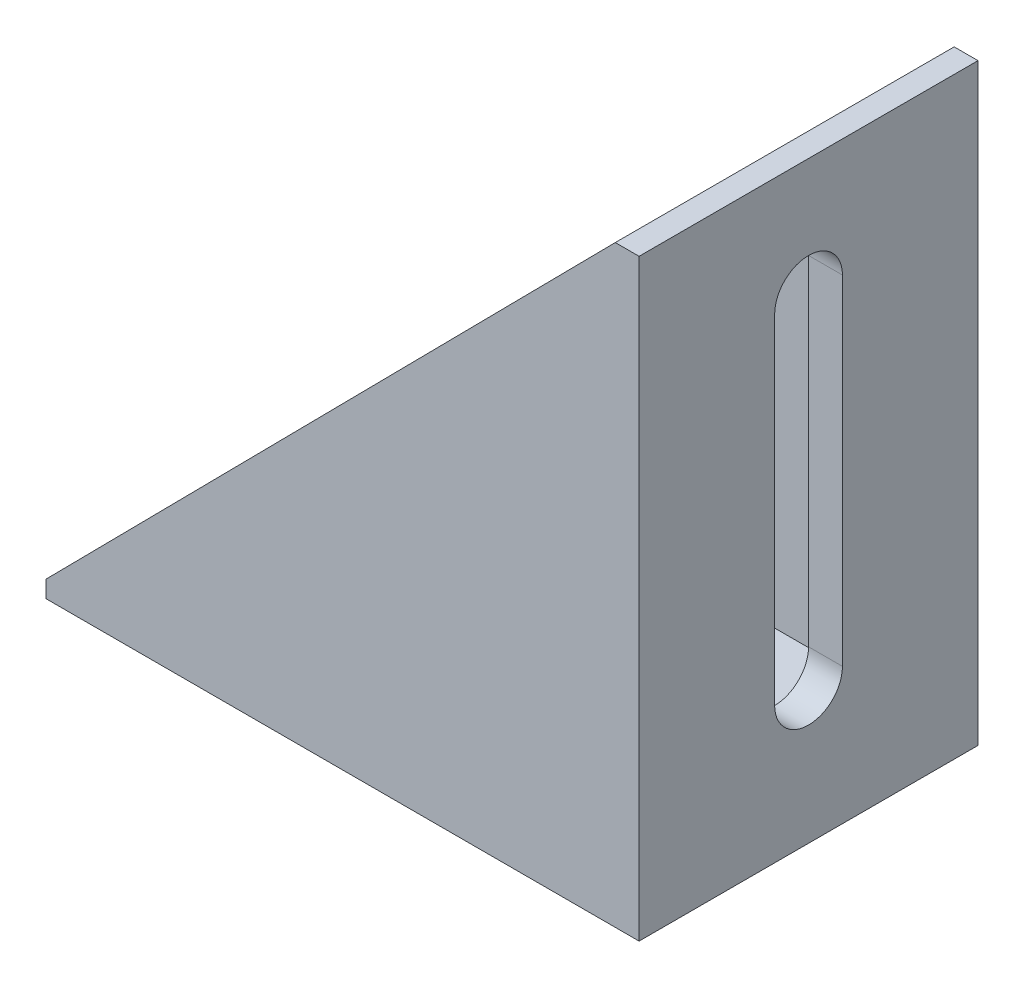
ISO-10303-21;
HEADER;
FILE_DESCRIPTION(('STEP AP214'),'2;1');
FILE_NAME('part.step','',(''),(''),'','','');
FILE_SCHEMA(('AUTOMOTIVE_DESIGN { 1 0 10303 214 1 1 1 1 }'));
ENDSEC;
DATA;
#1=APPLICATION_CONTEXT('core data for automotive mechanical design processes');
#2=APPLICATION_PROTOCOL_DEFINITION('international standard','automotive_design',2000,#1);
#3=PRODUCT_CONTEXT('',#1,'mechanical');
#4=PRODUCT('Part','Part','',(#3));
#5=PRODUCT_RELATED_PRODUCT_CATEGORY('part','',(#4));
#6=PRODUCT_DEFINITION_FORMATION('','',#4);
#7=PRODUCT_DEFINITION_CONTEXT('part definition',#1,'design');
#8=PRODUCT_DEFINITION('design','',#6,#7);
#9=PRODUCT_DEFINITION_SHAPE('','',#8);
#10=(LENGTH_UNIT() NAMED_UNIT(*) SI_UNIT(.MILLI.,.METRE.));
#11=(NAMED_UNIT(*) PLANE_ANGLE_UNIT() SI_UNIT($,.RADIAN.));
#12=(NAMED_UNIT(*) SI_UNIT($,.STERADIAN.) SOLID_ANGLE_UNIT());
#13=UNCERTAINTY_MEASURE_WITH_UNIT(LENGTH_MEASURE(1.E-05),#10,'distance_accuracy_value','');
#14=(GEOMETRIC_REPRESENTATION_CONTEXT(3) GLOBAL_UNCERTAINTY_ASSIGNED_CONTEXT((#13)) GLOBAL_UNIT_ASSIGNED_CONTEXT((#10,
#11,#12)) REPRESENTATION_CONTEXT('',''));
#15=CARTESIAN_POINT('',(0.,0.,0.));
#16=DIRECTION('',(0.,0.,1.));
#17=DIRECTION('',(1.,0.,0.));
#18=AXIS2_PLACEMENT_3D('',#15,#16,#17);
#19=CARTESIAN_POINT('',(0.,0.,10.));
#20=DIRECTION('',(1.,0.,0.));
#21=DIRECTION('',(0.,0.,-1.));
#22=AXIS2_PLACEMENT_3D('',#19,#20,#21);
#23=PLANE('',#22);
#24=DIRECTION('',(0.,-1.,0.));
#25=VECTOR('',#24,1.);
#26=CARTESIAN_POINT('',(0.,0.,0.));
#27=LINE('',#26,#25);
#28=CARTESIAN_POINT('',(0.,1.,0.));
#29=VERTEX_POINT('',#28);
#30=CARTESIAN_POINT('',(0.,0.,0.));
#31=VERTEX_POINT('',#30);
#32=EDGE_CURVE('E248',#29,#31,#27,.T.);
#33=ORIENTED_EDGE('',*,*,#32,.T.);
#34=DIRECTION('',(0.,0.,-1.));
#35=VECTOR('',#34,1.);
#36=CARTESIAN_POINT('',(0.,0.,10.));
#37=LINE('',#36,#35);
#38=CARTESIAN_POINT('',(0.,0.,20.));
#39=VERTEX_POINT('',#38);
#40=EDGE_CURVE('E268',#39,#31,#37,.T.);
#41=ORIENTED_EDGE('',*,*,#40,.F.);
#42=DIRECTION('',(0.,-1.,0.));
#43=VECTOR('',#42,1.);
#44=CARTESIAN_POINT('',(0.,0.,20.));
#45=LINE('',#44,#43);
#46=CARTESIAN_POINT('',(0.,1.,20.));
#47=VERTEX_POINT('',#46);
#48=EDGE_CURVE('E190',#47,#39,#45,.T.);
#49=ORIENTED_EDGE('',*,*,#48,.F.);
#50=DIRECTION('',(0.,0.,-1.));
#51=VECTOR('',#50,1.);
#52=CARTESIAN_POINT('',(0.,1.,10.));
#53=LINE('',#52,#51);
#54=EDGE_CURVE('E258',#47,#29,#53,.T.);
#55=ORIENTED_EDGE('',*,*,#54,.T.);
#56=EDGE_LOOP('',(#33,#41,#49,#55));
#57=FACE_BOUND('',#56,.T.);
#58=ADVANCED_FACE('F32',(#57),#23,.F.);
#59=CARTESIAN_POINT('',(0.,0.,10.));
#60=DIRECTION('',(0.,1.,0.));
#61=DIRECTION('',(0.,0.,1.));
#62=AXIS2_PLACEMENT_3D('',#59,#60,#61);
#63=PLANE('',#62);
#64=CARTESIAN_POINT('',(7.66929229058759,0.,10.));
#65=DIRECTION('',(0.,1.,0.));
#66=DIRECTION('',(0.,0.,1.));
#67=AXIS2_PLACEMENT_3D('',#64,#65,#66);
#68=CIRCLE('',#67,2.);
#69=CARTESIAN_POINT('',(7.66929229058759,0.,8.));
#70=VERTEX_POINT('',#69);
#71=CARTESIAN_POINT('',(7.66929229058759,0.,12.));
#72=VERTEX_POINT('',#71);
#73=EDGE_CURVE('E234',#70,#72,#68,.T.);
#74=ORIENTED_EDGE('',*,*,#73,.T.);
#75=DIRECTION('',(-1.,0.,0.));
#76=VECTOR('',#75,1.);
#77=CARTESIAN_POINT('',(0.,0.,12.));
#78=LINE('',#77,#76);
#79=CARTESIAN_POINT('',(27.6692922905876,0.,12.));
#80=VERTEX_POINT('',#79);
#81=EDGE_CURVE('E179',#80,#72,#78,.T.);
#82=ORIENTED_EDGE('',*,*,#81,.F.);
#83=CARTESIAN_POINT('',(27.6692922905876,0.,10.));
#84=DIRECTION('',(0.,1.,0.));
#85=DIRECTION('',(0.,0.,1.));
#86=AXIS2_PLACEMENT_3D('',#83,#84,#85);
#87=CIRCLE('',#86,2.);
#88=CARTESIAN_POINT('',(27.6692922905876,0.,8.));
#89=VERTEX_POINT('',#88);
#90=EDGE_CURVE('E227',#80,#89,#87,.T.);
#91=ORIENTED_EDGE('',*,*,#90,.T.);
#92=DIRECTION('',(-1.,0.,0.));
#93=VECTOR('',#92,1.);
#94=CARTESIAN_POINT('',(0.,0.,8.));
#95=LINE('',#94,#93);
#96=EDGE_CURVE('E231',#89,#70,#95,.T.);
#97=ORIENTED_EDGE('',*,*,#96,.T.);
#98=EDGE_LOOP('',(#74,#82,#91,#97));
#99=FACE_BOUND('',#98,.T.);
#100=DIRECTION('',(1.,0.,0.));
#101=VECTOR('',#100,1.);
#102=CARTESIAN_POINT('',(0.,0.,20.));
#103=LINE('',#102,#101);
#104=CARTESIAN_POINT('',(35.,0.,20.));
#105=VERTEX_POINT('',#104);
#106=EDGE_CURVE('E193',#39,#105,#103,.T.);
#107=ORIENTED_EDGE('',*,*,#106,.F.);
#108=ORIENTED_EDGE('',*,*,#40,.T.);
#109=DIRECTION('',(1.,0.,0.));
#110=VECTOR('',#109,1.);
#111=CARTESIAN_POINT('',(0.,0.,0.));
#112=LINE('',#111,#110);
#113=CARTESIAN_POINT('',(35.,0.,0.));
#114=VERTEX_POINT('',#113);
#115=EDGE_CURVE('E251',#31,#114,#112,.T.);
#116=ORIENTED_EDGE('',*,*,#115,.T.);
#117=DIRECTION('',(0.,0.,-1.));
#118=VECTOR('',#117,1.);
#119=CARTESIAN_POINT('',(35.,0.,10.));
#120=LINE('',#119,#118);
#121=EDGE_CURVE('E265',#105,#114,#120,.T.);
#122=ORIENTED_EDGE('',*,*,#121,.F.);
#123=EDGE_LOOP('',(#107,#108,#116,#122));
#124=FACE_BOUND('',#123,.T.);
#125=ADVANCED_FACE('F294',(#99,#124),#63,.F.);
#126=CARTESIAN_POINT('',(35.,0.,10.));
#127=DIRECTION('',(-1.,0.,0.));
#128=DIRECTION('',(0.,0.,1.));
#129=AXIS2_PLACEMENT_3D('',#126,#127,#128);
#130=PLANE('',#129);
#131=DIRECTION('',(0.,0.,-1.));
#132=VECTOR('',#131,1.);
#133=CARTESIAN_POINT('',(35.,35.,10.));
#134=LINE('',#133,#132);
#135=CARTESIAN_POINT('',(35.,35.,20.));
#136=VERTEX_POINT('',#135);
#137=CARTESIAN_POINT('',(35.,35.,0.));
#138=VERTEX_POINT('',#137);
#139=EDGE_CURVE('E262',#136,#138,#134,.T.);
#140=ORIENTED_EDGE('',*,*,#139,.F.);
#141=DIRECTION('',(0.,1.,0.));
#142=VECTOR('',#141,1.);
#143=CARTESIAN_POINT('',(35.,0.,20.));
#144=LINE('',#143,#142);
#145=EDGE_CURVE('E196',#105,#136,#144,.T.);
#146=ORIENTED_EDGE('',*,*,#145,.F.);
#147=ORIENTED_EDGE('',*,*,#121,.T.);
#148=DIRECTION('',(0.,1.,0.));
#149=VECTOR('',#148,1.);
#150=CARTESIAN_POINT('',(35.,0.,0.));
#151=LINE('',#150,#149);
#152=EDGE_CURVE('E253',#114,#138,#151,.T.);
#153=ORIENTED_EDGE('',*,*,#152,.T.);
#154=EDGE_LOOP('',(#140,#146,#147,#153));
#155=FACE_BOUND('',#154,.T.);
#156=DIRECTION('',(0.,-1.,0.));
#157=VECTOR('',#156,1.);
#158=CARTESIAN_POINT('',(35.,0.,12.));
#159=LINE('',#158,#157);
#160=CARTESIAN_POINT('',(35.,28.0425715749163,12.));
#161=VERTEX_POINT('',#160);
#162=CARTESIAN_POINT('',(35.,8.04257157491626,12.));
#163=VERTEX_POINT('',#162);
#164=EDGE_CURVE('E163',#161,#163,#159,.T.);
#165=ORIENTED_EDGE('',*,*,#164,.F.);
#166=CARTESIAN_POINT('',(35.,28.0425715749163,10.));
#167=DIRECTION('',(-1.,0.,0.));
#168=DIRECTION('',(0.,0.,1.));
#169=AXIS2_PLACEMENT_3D('',#166,#167,#168);
#170=CIRCLE('',#169,2.);
#171=CARTESIAN_POINT('',(35.,28.0425715749163,8.));
#172=VERTEX_POINT('',#171);
#173=EDGE_CURVE('E216',#161,#172,#170,.T.);
#174=ORIENTED_EDGE('',*,*,#173,.T.);
#175=DIRECTION('',(0.,-1.,0.));
#176=VECTOR('',#175,1.);
#177=CARTESIAN_POINT('',(35.,0.,8.));
#178=LINE('',#177,#176);
#179=CARTESIAN_POINT('',(35.,8.04257157491626,8.));
#180=VERTEX_POINT('',#179);
#181=EDGE_CURVE('E210',#172,#180,#178,.T.);
#182=ORIENTED_EDGE('',*,*,#181,.T.);
#183=CARTESIAN_POINT('',(35.,8.04257157491626,10.));
#184=DIRECTION('',(-1.,0.,0.));
#185=DIRECTION('',(0.,0.,1.));
#186=AXIS2_PLACEMENT_3D('',#183,#184,#185);
#187=CIRCLE('',#186,2.);
#188=EDGE_CURVE('E214',#180,#163,#187,.T.);
#189=ORIENTED_EDGE('',*,*,#188,.T.);
#190=EDGE_LOOP('',(#165,#174,#182,#189));
#191=FACE_BOUND('',#190,.T.);
#192=ADVANCED_FACE('F297',(#155,#191),#130,.F.);
#193=CARTESIAN_POINT('',(35.,35.,10.));
#194=DIRECTION('',(0.,-1.,0.));
#195=DIRECTION('',(0.,0.,-1.));
#196=AXIS2_PLACEMENT_3D('',#193,#194,#195);
#197=PLANE('',#196);
#198=DIRECTION('',(-1.,0.,0.));
#199=VECTOR('',#198,1.);
#200=CARTESIAN_POINT('',(35.,35.,0.));
#201=LINE('',#200,#199);
#202=CARTESIAN_POINT('',(33.5942254360332,35.,0.));
#203=VERTEX_POINT('',#202);
#204=EDGE_CURVE('E255',#138,#203,#201,.T.);
#205=ORIENTED_EDGE('',*,*,#204,.T.);
#206=DIRECTION('',(0.,0.,-1.));
#207=VECTOR('',#206,1.);
#208=CARTESIAN_POINT('',(33.5942254360332,35.,10.));
#209=LINE('',#208,#207);
#210=CARTESIAN_POINT('',(33.5942254360332,35.,20.));
#211=VERTEX_POINT('',#210);
#212=EDGE_CURVE('E260',#211,#203,#209,.T.);
#213=ORIENTED_EDGE('',*,*,#212,.F.);
#214=DIRECTION('',(-1.,0.,0.));
#215=VECTOR('',#214,1.);
#216=CARTESIAN_POINT('',(35.,35.,20.));
#217=LINE('',#216,#215);
#218=EDGE_CURVE('E199',#136,#211,#217,.T.);
#219=ORIENTED_EDGE('',*,*,#218,.F.);
#220=ORIENTED_EDGE('',*,*,#139,.T.);
#221=EDGE_LOOP('',(#205,#213,#219,#220));
#222=FACE_BOUND('',#221,.T.);
#223=ADVANCED_FACE('F314',(#222),#197,.F.);
#224=CARTESIAN_POINT('',(33.5942254360332,35.,10.));
#225=DIRECTION('',(0.711338793248483,-0.702849287699569,0.));
#226=DIRECTION('',(0.702849287699569,0.711338793248483,0.));
#227=AXIS2_PLACEMENT_3D('',#224,#225,#226);
#228=PLANE('',#227);
#229=DIRECTION('',(0.,0.,1.));
#230=VECTOR('',#229,1.);
#231=CARTESIAN_POINT('',(33.,34.398597093313,10.));
#232=LINE('',#231,#230);
#233=CARTESIAN_POINT('',(33.,34.398597093313,2.));
#234=VERTEX_POINT('',#233);
#235=CARTESIAN_POINT('',(33.,34.398597093313,18.));
#236=VERTEX_POINT('',#235);
#237=EDGE_CURVE('E246',#234,#236,#232,.T.);
#238=ORIENTED_EDGE('',*,*,#237,.T.);
#239=DIRECTION('',(0.702849287699569,0.711338793248483,0.));
#240=VECTOR('',#239,1.);
#241=CARTESIAN_POINT('',(33.5942254360332,35.,18.));
#242=LINE('',#241,#240);
#243=CARTESIAN_POINT('',(0.988065454000985,2.00000000000001,18.));
#244=VERTEX_POINT('',#243);
#245=EDGE_CURVE('E205',#244,#236,#242,.T.);
#246=ORIENTED_EDGE('',*,*,#245,.F.);
#247=DIRECTION('',(0.,0.,-1.));
#248=VECTOR('',#247,1.);
#249=CARTESIAN_POINT('',(0.988065454000979,2.,10.));
#250=LINE('',#249,#248);
#251=CARTESIAN_POINT('',(0.988065454000985,2.00000000000001,2.));
#252=VERTEX_POINT('',#251);
#253=EDGE_CURVE('E243',#244,#252,#250,.T.);
#254=ORIENTED_EDGE('',*,*,#253,.T.);
#255=DIRECTION('',(0.702849287699569,0.711338793248483,0.));
#256=VECTOR('',#255,1.);
#257=CARTESIAN_POINT('',(33.5942254360332,35.,2.));
#258=LINE('',#257,#256);
#259=EDGE_CURVE('E271',#252,#234,#258,.T.);
#260=ORIENTED_EDGE('',*,*,#259,.T.);
#261=EDGE_LOOP('',(#238,#246,#254,#260));
#262=FACE_BOUND('',#261,.T.);
#263=DIRECTION('',(-0.702849287699569,-0.711338793248483,0.));
#264=VECTOR('',#263,1.);
#265=CARTESIAN_POINT('',(33.5942254360332,35.,20.));
#266=LINE('',#265,#264);
#267=EDGE_CURVE('E202',#211,#47,#266,.T.);
#268=ORIENTED_EDGE('',*,*,#267,.F.);
#269=ORIENTED_EDGE('',*,*,#212,.T.);
#270=DIRECTION('',(-0.702849287699569,-0.711338793248483,0.));
#271=VECTOR('',#270,1.);
#272=CARTESIAN_POINT('',(33.5942254360332,35.,0.));
#273=LINE('',#272,#271);
#274=EDGE_CURVE('E54',#203,#29,#273,.T.);
#275=ORIENTED_EDGE('',*,*,#274,.T.);
#276=ORIENTED_EDGE('',*,*,#54,.F.);
#277=EDGE_LOOP('',(#268,#269,#275,#276));
#278=FACE_BOUND('',#277,.T.);
#279=ADVANCED_FACE('F315',(#262,#278),#228,.F.);
#280=CARTESIAN_POINT('',(0.,35.,0.));
#281=DIRECTION('',(0.,0.,1.));
#282=DIRECTION('',(1.,0.,0.));
#283=AXIS2_PLACEMENT_3D('',#280,#281,#282);
#284=PLANE('',#283);
#285=ORIENTED_EDGE('',*,*,#32,.F.);
#286=ORIENTED_EDGE('',*,*,#274,.F.);
#287=ORIENTED_EDGE('',*,*,#204,.F.);
#288=ORIENTED_EDGE('',*,*,#152,.F.);
#289=ORIENTED_EDGE('',*,*,#115,.F.);
#290=EDGE_LOOP('',(#285,#286,#287,#288,#289));
#291=FACE_BOUND('',#290,.T.);
#292=ADVANCED_FACE('F307',(#291),#284,.F.);
#293=CARTESIAN_POINT('',(33.,2.,2.));
#294=DIRECTION('',(0.,0.,-1.));
#295=DIRECTION('',(-1.,0.,0.));
#296=AXIS2_PLACEMENT_3D('',#293,#294,#295);
#297=PLANE('',#296);
#298=DIRECTION('',(1.,0.,0.));
#299=VECTOR('',#298,1.);
#300=CARTESIAN_POINT('',(3.79966524158823,2.,2.));
#301=LINE('',#300,#299);
#302=CARTESIAN_POINT('',(33.,2.,2.));
#303=VERTEX_POINT('',#302);
#304=EDGE_CURVE('E236',#252,#303,#301,.T.);
#305=ORIENTED_EDGE('',*,*,#304,.T.);
#306=DIRECTION('',(0.,1.,0.));
#307=VECTOR('',#306,1.);
#308=CARTESIAN_POINT('',(33.,2.,2.));
#309=LINE('',#308,#307);
#310=EDGE_CURVE('E238',#303,#234,#309,.T.);
#311=ORIENTED_EDGE('',*,*,#310,.T.);
#312=ORIENTED_EDGE('',*,*,#259,.F.);
#313=EDGE_LOOP('',(#305,#311,#312));
#314=FACE_BOUND('',#313,.T.);
#315=ADVANCED_FACE('F323',(#314),#297,.F.);
#316=CARTESIAN_POINT('',(33.,31.5530368359411,2.));
#317=DIRECTION('',(1.,0.,0.));
#318=DIRECTION('',(0.,0.,-1.));
#319=AXIS2_PLACEMENT_3D('',#316,#317,#318);
#320=PLANE('',#319);
#321=DIRECTION('',(0.,1.,0.));
#322=VECTOR('',#321,1.);
#323=CARTESIAN_POINT('',(33.,2.,18.));
#324=LINE('',#323,#322);
#325=CARTESIAN_POINT('',(33.,2.,18.));
#326=VERTEX_POINT('',#325);
#327=EDGE_CURVE('E187',#326,#236,#324,.T.);
#328=ORIENTED_EDGE('',*,*,#327,.T.);
#329=ORIENTED_EDGE('',*,*,#237,.F.);
#330=ORIENTED_EDGE('',*,*,#310,.F.);
#331=DIRECTION('',(0.,0.,1.));
#332=VECTOR('',#331,1.);
#333=CARTESIAN_POINT('',(33.,2.,2.));
#334=LINE('',#333,#332);
#335=EDGE_CURVE('E241',#303,#326,#334,.T.);
#336=ORIENTED_EDGE('',*,*,#335,.T.);
#337=EDGE_LOOP('',(#328,#329,#330,#336));
#338=FACE_BOUND('',#337,.T.);
#339=DIRECTION('',(0.,-1.,0.));
#340=VECTOR('',#339,1.);
#341=CARTESIAN_POINT('',(33.,28.0425715749163,8.));
#342=LINE('',#341,#340);
#343=CARTESIAN_POINT('',(33.,28.0425715749163,8.));
#344=VERTEX_POINT('',#343);
#345=CARTESIAN_POINT('',(33.,8.04257157491626,8.));
#346=VERTEX_POINT('',#345);
#347=EDGE_CURVE('E155',#344,#346,#342,.T.);
#348=ORIENTED_EDGE('',*,*,#347,.F.);
#349=CARTESIAN_POINT('',(33.,28.0425715749163,10.));
#350=DIRECTION('',(1.,0.,0.));
#351=DIRECTION('',(0.,0.,-1.));
#352=AXIS2_PLACEMENT_3D('',#349,#350,#351);
#353=CIRCLE('',#352,2.);
#354=CARTESIAN_POINT('',(33.,28.0425715749163,12.));
#355=VERTEX_POINT('',#354);
#356=EDGE_CURVE('E11',#344,#355,#353,.T.);
#357=ORIENTED_EDGE('',*,*,#356,.T.);
#358=DIRECTION('',(0.,-1.,0.));
#359=VECTOR('',#358,1.);
#360=CARTESIAN_POINT('',(33.,28.0425715749163,12.));
#361=LINE('',#360,#359);
#362=CARTESIAN_POINT('',(33.,8.04257157491626,12.));
#363=VERTEX_POINT('',#362);
#364=EDGE_CURVE('E161',#355,#363,#361,.T.);
#365=ORIENTED_EDGE('',*,*,#364,.T.);
#366=CARTESIAN_POINT('',(33.,8.04257157491626,10.));
#367=DIRECTION('',(-1.,0.,0.));
#368=DIRECTION('',(0.,0.,1.));
#369=AXIS2_PLACEMENT_3D('',#366,#367,#368);
#370=CIRCLE('',#369,2.);
#371=EDGE_CURVE('E145',#346,#363,#370,.T.);
#372=ORIENTED_EDGE('',*,*,#371,.F.);
#373=EDGE_LOOP('',(#348,#357,#365,#372));
#374=FACE_BOUND('',#373,.T.);
#375=ADVANCED_FACE('F166',(#338,#374),#320,.F.);
#376=CARTESIAN_POINT('',(3.79966524158823,2.,2.));
#377=DIRECTION('',(0.,-1.,0.));
#378=DIRECTION('',(1.,0.,0.));
#379=AXIS2_PLACEMENT_3D('',#376,#377,#378);
#380=PLANE('',#379);
#381=DIRECTION('',(-1.,0.,0.));
#382=VECTOR('',#381,1.);
#383=CARTESIAN_POINT('',(7.66929229058759,2.,12.));
#384=LINE('',#383,#382);
#385=CARTESIAN_POINT('',(27.6692922905876,2.,12.));
#386=VERTEX_POINT('',#385);
#387=CARTESIAN_POINT('',(7.66929229058759,2.,12.));
#388=VERTEX_POINT('',#387);
#389=EDGE_CURVE('E172',#386,#388,#384,.T.);
#390=ORIENTED_EDGE('',*,*,#389,.T.);
#391=CARTESIAN_POINT('',(7.66929229058759,2.,10.));
#392=DIRECTION('',(0.,1.,0.));
#393=DIRECTION('',(-1.,0.,0.));
#394=AXIS2_PLACEMENT_3D('',#391,#392,#393);
#395=CIRCLE('',#394,2.);
#396=CARTESIAN_POINT('',(7.66929229058759,2.,8.));
#397=VERTEX_POINT('',#396);
#398=EDGE_CURVE('E219',#397,#388,#395,.T.);
#399=ORIENTED_EDGE('',*,*,#398,.F.);
#400=DIRECTION('',(-1.,0.,0.));
#401=VECTOR('',#400,1.);
#402=CARTESIAN_POINT('',(7.66929229058759,2.,8.));
#403=LINE('',#402,#401);
#404=CARTESIAN_POINT('',(27.6692922905876,2.,8.));
#405=VERTEX_POINT('',#404);
#406=EDGE_CURVE('E221',#405,#397,#403,.T.);
#407=ORIENTED_EDGE('',*,*,#406,.F.);
#408=CARTESIAN_POINT('',(27.6692922905876,2.,10.));
#409=DIRECTION('',(0.,-1.,0.));
#410=DIRECTION('',(1.,0.,0.));
#411=AXIS2_PLACEMENT_3D('',#408,#409,#410);
#412=CIRCLE('',#411,2.);
#413=EDGE_CURVE('E39',#405,#386,#412,.T.);
#414=ORIENTED_EDGE('',*,*,#413,.T.);
#415=EDGE_LOOP('',(#390,#399,#407,#414));
#416=FACE_BOUND('',#415,.T.);
#417=ORIENTED_EDGE('',*,*,#253,.F.);
#418=DIRECTION('',(1.,0.,0.));
#419=VECTOR('',#418,1.);
#420=CARTESIAN_POINT('',(3.79966524158823,2.,18.));
#421=LINE('',#420,#419);
#422=EDGE_CURVE('E184',#244,#326,#421,.T.);
#423=ORIENTED_EDGE('',*,*,#422,.T.);
#424=ORIENTED_EDGE('',*,*,#335,.F.);
#425=ORIENTED_EDGE('',*,*,#304,.F.);
#426=EDGE_LOOP('',(#417,#423,#424,#425));
#427=FACE_BOUND('',#426,.T.);
#428=ADVANCED_FACE('F276',(#416,#427),#380,.F.);
#429=CARTESIAN_POINT('',(7.66929229058759,-6.,10.));
#430=DIRECTION('',(0.,1.,0.));
#431=DIRECTION('',(-1.,0.,0.));
#432=AXIS2_PLACEMENT_3D('',#429,#430,#431);
#433=CYLINDRICAL_SURFACE('',#432,2.);
#434=DIRECTION('',(0.,1.,0.));
#435=VECTOR('',#434,1.);
#436=CARTESIAN_POINT('',(7.66929229058759,-6.,8.));
#437=LINE('',#436,#435);
#438=EDGE_CURVE('E225',#70,#397,#437,.T.);
#439=ORIENTED_EDGE('',*,*,#438,.T.);
#440=ORIENTED_EDGE('',*,*,#398,.T.);
#441=DIRECTION('',(0.,1.,0.));
#442=VECTOR('',#441,1.);
#443=CARTESIAN_POINT('',(7.66929229058759,-6.,12.));
#444=LINE('',#443,#442);
#445=EDGE_CURVE('E176',#72,#388,#444,.T.);
#446=ORIENTED_EDGE('',*,*,#445,.F.);
#447=ORIENTED_EDGE('',*,*,#73,.F.);
#448=EDGE_LOOP('',(#439,#440,#446,#447));
#449=FACE_BOUND('',#448,.T.);
#450=ADVANCED_FACE('F289',(#449),#433,.F.);
#451=CARTESIAN_POINT('',(7.66929229058759,-6.,8.));
#452=DIRECTION('',(0.,0.,-1.));
#453=DIRECTION('',(-1.,0.,0.));
#454=AXIS2_PLACEMENT_3D('',#451,#452,#453);
#455=PLANE('',#454);
#456=DIRECTION('',(0.,1.,0.));
#457=VECTOR('',#456,1.);
#458=CARTESIAN_POINT('',(27.6692922905876,-6.,8.));
#459=LINE('',#458,#457);
#460=EDGE_CURVE('E224',#89,#405,#459,.T.);
#461=ORIENTED_EDGE('',*,*,#460,.T.);
#462=ORIENTED_EDGE('',*,*,#406,.T.);
#463=ORIENTED_EDGE('',*,*,#438,.F.);
#464=ORIENTED_EDGE('',*,*,#96,.F.);
#465=EDGE_LOOP('',(#461,#462,#463,#464));
#466=FACE_BOUND('',#465,.T.);
#467=ADVANCED_FACE('F292',(#466),#455,.F.);
#468=CARTESIAN_POINT('',(27.6692922905876,-6.,10.));
#469=DIRECTION('',(0.,1.,0.));
#470=DIRECTION('',(-1.,0.,0.));
#471=AXIS2_PLACEMENT_3D('',#468,#469,#470);
#472=CYLINDRICAL_SURFACE('',#471,2.);
#473=ORIENTED_EDGE('',*,*,#90,.F.);
#474=DIRECTION('',(0.,1.,0.));
#475=VECTOR('',#474,1.);
#476=CARTESIAN_POINT('',(27.6692922905876,-6.,12.));
#477=LINE('',#476,#475);
#478=EDGE_CURVE('E175',#80,#386,#477,.T.);
#479=ORIENTED_EDGE('',*,*,#478,.T.);
#480=ORIENTED_EDGE('',*,*,#413,.F.);
#481=ORIENTED_EDGE('',*,*,#460,.F.);
#482=EDGE_LOOP('',(#473,#479,#480,#481));
#483=FACE_BOUND('',#482,.T.);
#484=ADVANCED_FACE('F283',(#483),#472,.F.);
#485=CARTESIAN_POINT('',(41.,28.0425715749163,10.));
#486=DIRECTION('',(-1.,0.,0.));
#487=DIRECTION('',(0.,0.,1.));
#488=AXIS2_PLACEMENT_3D('',#485,#486,#487);
#489=CYLINDRICAL_SURFACE('',#488,2.);
#490=ORIENTED_EDGE('',*,*,#173,.F.);
#491=DIRECTION('',(-1.,0.,0.));
#492=VECTOR('',#491,1.);
#493=CARTESIAN_POINT('',(41.,28.0425715749163,12.));
#494=LINE('',#493,#492);
#495=EDGE_CURVE('E164',#161,#355,#494,.T.);
#496=ORIENTED_EDGE('',*,*,#495,.T.);
#497=ORIENTED_EDGE('',*,*,#356,.F.);
#498=DIRECTION('',(-1.,0.,0.));
#499=VECTOR('',#498,1.);
#500=CARTESIAN_POINT('',(41.,28.0425715749163,8.));
#501=LINE('',#500,#499);
#502=EDGE_CURVE('E46',#172,#344,#501,.T.);
#503=ORIENTED_EDGE('',*,*,#502,.F.);
#504=EDGE_LOOP('',(#490,#496,#497,#503));
#505=FACE_BOUND('',#504,.T.);
#506=ADVANCED_FACE('F389',(#505),#489,.F.);
#507=CARTESIAN_POINT('',(41.,8.04257157491626,10.));
#508=DIRECTION('',(-1.,0.,0.));
#509=DIRECTION('',(0.,0.,1.));
#510=AXIS2_PLACEMENT_3D('',#507,#508,#509);
#511=CYLINDRICAL_SURFACE('',#510,2.);
#512=DIRECTION('',(-1.,0.,0.));
#513=VECTOR('',#512,1.);
#514=CARTESIAN_POINT('',(41.,8.04257157491626,8.));
#515=LINE('',#514,#513);
#516=EDGE_CURVE('E151',#180,#346,#515,.T.);
#517=ORIENTED_EDGE('',*,*,#516,.T.);
#518=ORIENTED_EDGE('',*,*,#371,.T.);
#519=DIRECTION('',(-1.,0.,0.));
#520=VECTOR('',#519,1.);
#521=CARTESIAN_POINT('',(41.,8.04257157491626,12.));
#522=LINE('',#521,#520);
#523=EDGE_CURVE('E148',#163,#363,#522,.T.);
#524=ORIENTED_EDGE('',*,*,#523,.F.);
#525=ORIENTED_EDGE('',*,*,#188,.F.);
#526=EDGE_LOOP('',(#517,#518,#524,#525));
#527=FACE_BOUND('',#526,.T.);
#528=ADVANCED_FACE('F147',(#527),#511,.F.);
#529=CARTESIAN_POINT('',(41.,28.0425715749163,8.));
#530=DIRECTION('',(0.,0.,-1.));
#531=DIRECTION('',(-1.,0.,0.));
#532=AXIS2_PLACEMENT_3D('',#529,#530,#531);
#533=PLANE('',#532);
#534=ORIENTED_EDGE('',*,*,#502,.T.);
#535=ORIENTED_EDGE('',*,*,#347,.T.);
#536=ORIENTED_EDGE('',*,*,#516,.F.);
#537=ORIENTED_EDGE('',*,*,#181,.F.);
#538=EDGE_LOOP('',(#534,#535,#536,#537));
#539=FACE_BOUND('',#538,.T.);
#540=ADVANCED_FACE('F409',(#539),#533,.F.);
#541=CARTESIAN_POINT('',(0.,35.,20.));
#542=DIRECTION('',(0.,0.,-1.));
#543=DIRECTION('',(1.,0.,0.));
#544=AXIS2_PLACEMENT_3D('',#541,#542,#543);
#545=PLANE('',#544);
#546=ORIENTED_EDGE('',*,*,#48,.T.);
#547=ORIENTED_EDGE('',*,*,#106,.T.);
#548=ORIENTED_EDGE('',*,*,#145,.T.);
#549=ORIENTED_EDGE('',*,*,#218,.T.);
#550=ORIENTED_EDGE('',*,*,#267,.T.);
#551=EDGE_LOOP('',(#546,#547,#548,#549,#550));
#552=FACE_BOUND('',#551,.T.);
#553=ADVANCED_FACE('F302',(#552),#545,.F.);
#554=CARTESIAN_POINT('',(33.,2.,18.));
#555=DIRECTION('',(0.,0.,1.));
#556=DIRECTION('',(-1.,0.,0.));
#557=AXIS2_PLACEMENT_3D('',#554,#555,#556);
#558=PLANE('',#557);
#559=ORIENTED_EDGE('',*,*,#422,.F.);
#560=ORIENTED_EDGE('',*,*,#245,.T.);
#561=ORIENTED_EDGE('',*,*,#327,.F.);
#562=EDGE_LOOP('',(#559,#560,#561));
#563=FACE_BOUND('',#562,.T.);
#564=ADVANCED_FACE('F420',(#563),#558,.F.);
#565=CARTESIAN_POINT('',(7.66929229058759,-6.,12.));
#566=DIRECTION('',(0.,0.,1.));
#567=DIRECTION('',(-1.,0.,0.));
#568=AXIS2_PLACEMENT_3D('',#565,#566,#567);
#569=PLANE('',#568);
#570=ORIENTED_EDGE('',*,*,#478,.F.);
#571=ORIENTED_EDGE('',*,*,#81,.T.);
#572=ORIENTED_EDGE('',*,*,#445,.T.);
#573=ORIENTED_EDGE('',*,*,#389,.F.);
#574=EDGE_LOOP('',(#570,#571,#572,#573));
#575=FACE_BOUND('',#574,.T.);
#576=ADVANCED_FACE('F286',(#575),#569,.F.);
#577=CARTESIAN_POINT('',(41.,28.0425715749163,12.));
#578=DIRECTION('',(0.,0.,1.));
#579=DIRECTION('',(-1.,0.,0.));
#580=AXIS2_PLACEMENT_3D('',#577,#578,#579);
#581=PLANE('',#580);
#582=ORIENTED_EDGE('',*,*,#495,.F.);
#583=ORIENTED_EDGE('',*,*,#164,.T.);
#584=ORIENTED_EDGE('',*,*,#523,.T.);
#585=ORIENTED_EDGE('',*,*,#364,.F.);
#586=EDGE_LOOP('',(#582,#583,#584,#585));
#587=FACE_BOUND('',#586,.T.);
#588=ADVANCED_FACE('F160',(#587),#581,.F.);
#589=CLOSED_SHELL('',(#58,#125,#192,#223,#279,#292,#315,#375,#428,#450,#467,#484,#506,#528,#540,
#553,#564,#576,#588));
#590=MANIFOLD_SOLID_BREP('B2',#589);
#591=ADVANCED_BREP_SHAPE_REPRESENTATION('',(#18,#590),#14);
#592=SHAPE_DEFINITION_REPRESENTATION(#9,#591);
ENDSEC;
END-ISO-10303-21;
